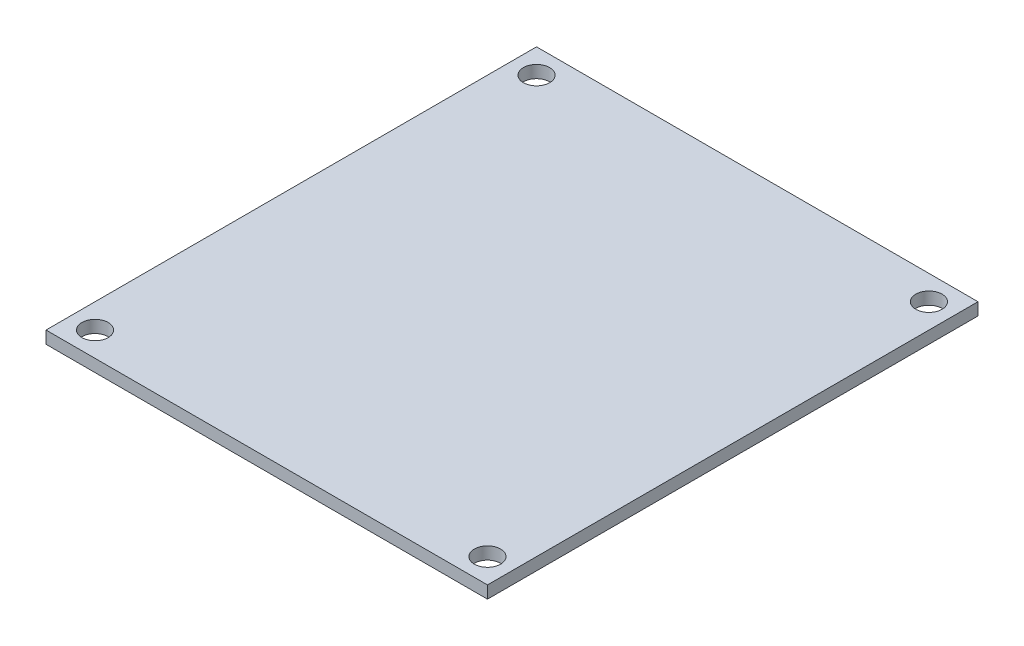
ISO-10303-21;
HEADER;
FILE_DESCRIPTION(('STEP AP214'),'2;1');
FILE_NAME('part.step','',(''),(''),'','','');
FILE_SCHEMA(('AUTOMOTIVE_DESIGN { 1 0 10303 214 1 1 1 1 }'));
ENDSEC;
DATA;
#1=APPLICATION_CONTEXT('core data for automotive mechanical design processes');
#2=APPLICATION_PROTOCOL_DEFINITION('international standard','automotive_design',2000,#1);
#3=PRODUCT_CONTEXT('',#1,'mechanical');
#4=PRODUCT('Part','Part','',(#3));
#5=PRODUCT_RELATED_PRODUCT_CATEGORY('part','',(#4));
#6=PRODUCT_DEFINITION_FORMATION('','',#4);
#7=PRODUCT_DEFINITION_CONTEXT('part definition',#1,'design');
#8=PRODUCT_DEFINITION('design','',#6,#7);
#9=PRODUCT_DEFINITION_SHAPE('','',#8);
#10=(LENGTH_UNIT() NAMED_UNIT(*) SI_UNIT(.MILLI.,.METRE.));
#11=(NAMED_UNIT(*) PLANE_ANGLE_UNIT() SI_UNIT($,.RADIAN.));
#12=(NAMED_UNIT(*) SI_UNIT($,.STERADIAN.) SOLID_ANGLE_UNIT());
#13=UNCERTAINTY_MEASURE_WITH_UNIT(LENGTH_MEASURE(1.E-05),#10,'distance_accuracy_value','');
#14=(GEOMETRIC_REPRESENTATION_CONTEXT(3) GLOBAL_UNCERTAINTY_ASSIGNED_CONTEXT((#13)) GLOBAL_UNIT_ASSIGNED_CONTEXT((#10,
#11,#12)) REPRESENTATION_CONTEXT('',''));
#15=CARTESIAN_POINT('',(0.,0.,0.));
#16=DIRECTION('',(0.,0.,1.));
#17=DIRECTION('',(1.,0.,0.));
#18=AXIS2_PLACEMENT_3D('',#15,#16,#17);
#19=CARTESIAN_POINT('',(28.575,1.6,31.75));
#20=DIRECTION('',(-1.,0.,0.));
#21=DIRECTION('',(0.,0.,1.));
#22=AXIS2_PLACEMENT_3D('',#19,#20,#21);
#23=PLANE('',#22);
#24=DIRECTION('',(0.,0.,-1.));
#25=VECTOR('',#24,1.);
#26=CARTESIAN_POINT('',(28.575,0.,31.75));
#27=LINE('',#26,#25);
#28=CARTESIAN_POINT('',(28.575,0.,31.75));
#29=VERTEX_POINT('',#28);
#30=CARTESIAN_POINT('',(28.575,0.,-31.75));
#31=VERTEX_POINT('',#30);
#32=EDGE_CURVE('E100',#29,#31,#27,.T.);
#33=ORIENTED_EDGE('',*,*,#32,.T.);
#34=DIRECTION('',(0.,-1.,0.));
#35=VECTOR('',#34,1.);
#36=CARTESIAN_POINT('',(28.575,1.6,-31.75));
#37=LINE('',#36,#35);
#38=CARTESIAN_POINT('',(28.575,1.6,-31.75));
#39=VERTEX_POINT('',#38);
#40=EDGE_CURVE('E11',#39,#31,#37,.T.);
#41=ORIENTED_EDGE('',*,*,#40,.F.);
#42=DIRECTION('',(0.,0.,-1.));
#43=VECTOR('',#42,1.);
#44=CARTESIAN_POINT('',(28.575,1.6,31.75));
#45=LINE('',#44,#43);
#46=CARTESIAN_POINT('',(28.575,1.6,31.75));
#47=VERTEX_POINT('',#46);
#48=EDGE_CURVE('E87',#47,#39,#45,.T.);
#49=ORIENTED_EDGE('',*,*,#48,.F.);
#50=DIRECTION('',(0.,-1.,0.));
#51=VECTOR('',#50,1.);
#52=CARTESIAN_POINT('',(28.575,1.6,31.75));
#53=LINE('',#52,#51);
#54=EDGE_CURVE('E96',#47,#29,#53,.T.);
#55=ORIENTED_EDGE('',*,*,#54,.T.);
#56=EDGE_LOOP('',(#33,#41,#49,#55));
#57=FACE_BOUND('',#56,.T.);
#58=ADVANCED_FACE('F34',(#57),#23,.F.);
#59=CARTESIAN_POINT('',(-28.575,1.6,-31.75));
#60=DIRECTION('',(0.,0.,1.));
#61=DIRECTION('',(1.,0.,0.));
#62=AXIS2_PLACEMENT_3D('',#59,#60,#61);
#63=PLANE('',#62);
#64=DIRECTION('',(-1.,0.,0.));
#65=VECTOR('',#64,1.);
#66=CARTESIAN_POINT('',(-28.575,0.,-31.75));
#67=LINE('',#66,#65);
#68=CARTESIAN_POINT('',(-28.575,0.,-31.75));
#69=VERTEX_POINT('',#68);
#70=EDGE_CURVE('E91',#31,#69,#67,.T.);
#71=ORIENTED_EDGE('',*,*,#70,.T.);
#72=DIRECTION('',(0.,-1.,0.));
#73=VECTOR('',#72,1.);
#74=CARTESIAN_POINT('',(-28.575,1.6,-31.75));
#75=LINE('',#74,#73);
#76=CARTESIAN_POINT('',(-28.575,1.6,-31.75));
#77=VERTEX_POINT('',#76);
#78=EDGE_CURVE('E43',#77,#69,#75,.T.);
#79=ORIENTED_EDGE('',*,*,#78,.F.);
#80=DIRECTION('',(-1.,0.,0.));
#81=VECTOR('',#80,1.);
#82=CARTESIAN_POINT('',(-28.575,1.6,-31.75));
#83=LINE('',#82,#81);
#84=EDGE_CURVE('E82',#39,#77,#83,.T.);
#85=ORIENTED_EDGE('',*,*,#84,.F.);
#86=ORIENTED_EDGE('',*,*,#40,.T.);
#87=EDGE_LOOP('',(#71,#79,#85,#86));
#88=FACE_BOUND('',#87,.T.);
#89=ADVANCED_FACE('F90',(#88),#63,.F.);
#90=CARTESIAN_POINT('',(-28.575,1.6,31.75));
#91=DIRECTION('',(1.,0.,0.));
#92=DIRECTION('',(0.,0.,-1.));
#93=AXIS2_PLACEMENT_3D('',#90,#91,#92);
#94=PLANE('',#93);
#95=DIRECTION('',(0.,0.,1.));
#96=VECTOR('',#95,1.);
#97=CARTESIAN_POINT('',(-28.575,0.,31.75));
#98=LINE('',#97,#96);
#99=CARTESIAN_POINT('',(-28.575,0.,31.75));
#100=VERTEX_POINT('',#99);
#101=EDGE_CURVE('E69',#69,#100,#98,.T.);
#102=ORIENTED_EDGE('',*,*,#101,.T.);
#103=DIRECTION('',(0.,-1.,0.));
#104=VECTOR('',#103,1.);
#105=CARTESIAN_POINT('',(-28.575,1.6,31.75));
#106=LINE('',#105,#104);
#107=CARTESIAN_POINT('',(-28.575,1.6,31.75));
#108=VERTEX_POINT('',#107);
#109=EDGE_CURVE('E92',#108,#100,#106,.T.);
#110=ORIENTED_EDGE('',*,*,#109,.F.);
#111=DIRECTION('',(0.,0.,1.));
#112=VECTOR('',#111,1.);
#113=CARTESIAN_POINT('',(-28.575,1.6,31.75));
#114=LINE('',#113,#112);
#115=EDGE_CURVE('E85',#77,#108,#114,.T.);
#116=ORIENTED_EDGE('',*,*,#115,.F.);
#117=ORIENTED_EDGE('',*,*,#78,.T.);
#118=EDGE_LOOP('',(#102,#110,#116,#117));
#119=FACE_BOUND('',#118,.T.);
#120=ADVANCED_FACE('F94',(#119),#94,.F.);
#121=CARTESIAN_POINT('',(-28.575,1.6,31.75));
#122=DIRECTION('',(0.,0.,-1.));
#123=DIRECTION('',(-1.,0.,0.));
#124=AXIS2_PLACEMENT_3D('',#121,#122,#123);
#125=PLANE('',#124);
#126=DIRECTION('',(1.,0.,0.));
#127=VECTOR('',#126,1.);
#128=CARTESIAN_POINT('',(-28.575,0.,31.75));
#129=LINE('',#128,#127);
#130=EDGE_CURVE('E75',#100,#29,#129,.T.);
#131=ORIENTED_EDGE('',*,*,#130,.T.);
#132=ORIENTED_EDGE('',*,*,#54,.F.);
#133=DIRECTION('',(1.,0.,0.));
#134=VECTOR('',#133,1.);
#135=CARTESIAN_POINT('',(-28.575,1.6,31.75));
#136=LINE('',#135,#134);
#137=EDGE_CURVE('E52',#108,#47,#136,.T.);
#138=ORIENTED_EDGE('',*,*,#137,.F.);
#139=ORIENTED_EDGE('',*,*,#109,.T.);
#140=EDGE_LOOP('',(#131,#132,#138,#139));
#141=FACE_BOUND('',#140,.T.);
#142=ADVANCED_FACE('F143',(#141),#125,.F.);
#143=CARTESIAN_POINT('',(0.,1.6,0.));
#144=DIRECTION('',(0.,-1.,0.));
#145=DIRECTION('',(0.,0.,-1.));
#146=AXIS2_PLACEMENT_3D('',#143,#144,#145);
#147=PLANE('',#146);
#148=CARTESIAN_POINT('',(-25.4,1.6,-28.575));
#149=DIRECTION('',(0.,1.,0.));
#150=DIRECTION('',(0.,0.,1.));
#151=AXIS2_PLACEMENT_3D('',#148,#149,#150);
#152=CIRCLE('',#151,1.69999999999999);
#153=CARTESIAN_POINT('',(-25.4,1.6,-26.875));
#154=VERTEX_POINT('',#153);
#155=EDGE_CURVE('E125',#154,#154,#152,.T.);
#156=ORIENTED_EDGE('',*,*,#155,.F.);
#157=EDGE_LOOP('',(#156));
#158=FACE_BOUND('',#157,.T.);
#159=CARTESIAN_POINT('',(25.4,1.6,-28.575));
#160=DIRECTION('',(0.,1.,0.));
#161=DIRECTION('',(0.,0.,1.));
#162=AXIS2_PLACEMENT_3D('',#159,#160,#161);
#163=CIRCLE('',#162,1.69999999999999);
#164=CARTESIAN_POINT('',(25.4,1.6,-26.875));
#165=VERTEX_POINT('',#164);
#166=EDGE_CURVE('E115',#165,#165,#163,.T.);
#167=ORIENTED_EDGE('',*,*,#166,.F.);
#168=EDGE_LOOP('',(#167));
#169=FACE_BOUND('',#168,.T.);
#170=CARTESIAN_POINT('',(25.4,1.6,28.575));
#171=DIRECTION('',(0.,1.,0.));
#172=DIRECTION('',(0.,0.,1.));
#173=AXIS2_PLACEMENT_3D('',#170,#171,#172);
#174=CIRCLE('',#173,1.69999999999999);
#175=CARTESIAN_POINT('',(25.4,1.6,30.275));
#176=VERTEX_POINT('',#175);
#177=EDGE_CURVE('E112',#176,#176,#174,.T.);
#178=ORIENTED_EDGE('',*,*,#177,.F.);
#179=EDGE_LOOP('',(#178));
#180=FACE_BOUND('',#179,.T.);
#181=CARTESIAN_POINT('',(-25.4,1.6,28.575));
#182=DIRECTION('',(0.,1.,0.));
#183=DIRECTION('',(0.,0.,1.));
#184=AXIS2_PLACEMENT_3D('',#181,#182,#183);
#185=CIRCLE('',#184,1.69999999999999);
#186=CARTESIAN_POINT('',(-25.4,1.6,30.275));
#187=VERTEX_POINT('',#186);
#188=EDGE_CURVE('E111',#187,#187,#185,.T.);
#189=ORIENTED_EDGE('',*,*,#188,.F.);
#190=EDGE_LOOP('',(#189));
#191=FACE_BOUND('',#190,.T.);
#192=ORIENTED_EDGE('',*,*,#48,.T.);
#193=ORIENTED_EDGE('',*,*,#84,.T.);
#194=ORIENTED_EDGE('',*,*,#115,.T.);
#195=ORIENTED_EDGE('',*,*,#137,.T.);
#196=EDGE_LOOP('',(#192,#193,#194,#195));
#197=FACE_BOUND('',#196,.T.);
#198=ADVANCED_FACE('F83',(#158,#169,#180,#191,#197),#147,.F.);
#199=CARTESIAN_POINT('',(0.,0.,0.));
#200=DIRECTION('',(0.,-1.,0.));
#201=DIRECTION('',(0.,0.,-1.));
#202=AXIS2_PLACEMENT_3D('',#199,#200,#201);
#203=PLANE('',#202);
#204=CARTESIAN_POINT('',(-25.4,0.,-28.575));
#205=DIRECTION('',(0.,-1.,0.));
#206=DIRECTION('',(0.,0.,-1.));
#207=AXIS2_PLACEMENT_3D('',#204,#205,#206);
#208=CIRCLE('',#207,1.69999999999999);
#209=CARTESIAN_POINT('',(-25.4,0.,-30.275));
#210=VERTEX_POINT('',#209);
#211=EDGE_CURVE('E37',#210,#210,#208,.T.);
#212=ORIENTED_EDGE('',*,*,#211,.F.);
#213=EDGE_LOOP('',(#212));
#214=FACE_BOUND('',#213,.T.);
#215=CARTESIAN_POINT('',(25.4,0.,-28.575));
#216=DIRECTION('',(0.,-1.,0.));
#217=DIRECTION('',(0.,0.,-1.));
#218=AXIS2_PLACEMENT_3D('',#215,#216,#217);
#219=CIRCLE('',#218,1.69999999999999);
#220=CARTESIAN_POINT('',(25.4,0.,-30.275));
#221=VERTEX_POINT('',#220);
#222=EDGE_CURVE('E113',#221,#221,#219,.T.);
#223=ORIENTED_EDGE('',*,*,#222,.F.);
#224=EDGE_LOOP('',(#223));
#225=FACE_BOUND('',#224,.T.);
#226=CARTESIAN_POINT('',(25.4,0.,28.575));
#227=DIRECTION('',(0.,-1.,0.));
#228=DIRECTION('',(0.,0.,-1.));
#229=AXIS2_PLACEMENT_3D('',#226,#227,#228);
#230=CIRCLE('',#229,1.69999999999999);
#231=CARTESIAN_POINT('',(25.4,0.,26.875));
#232=VERTEX_POINT('',#231);
#233=EDGE_CURVE('E109',#232,#232,#230,.T.);
#234=ORIENTED_EDGE('',*,*,#233,.F.);
#235=EDGE_LOOP('',(#234));
#236=FACE_BOUND('',#235,.T.);
#237=CARTESIAN_POINT('',(-25.4,0.,28.575));
#238=DIRECTION('',(0.,-1.,0.));
#239=DIRECTION('',(0.,0.,-1.));
#240=AXIS2_PLACEMENT_3D('',#237,#238,#239);
#241=CIRCLE('',#240,1.69999999999999);
#242=CARTESIAN_POINT('',(-25.4,0.,26.875));
#243=VERTEX_POINT('',#242);
#244=EDGE_CURVE('E103',#243,#243,#241,.T.);
#245=ORIENTED_EDGE('',*,*,#244,.F.);
#246=EDGE_LOOP('',(#245));
#247=FACE_BOUND('',#246,.T.);
#248=ORIENTED_EDGE('',*,*,#32,.F.);
#249=ORIENTED_EDGE('',*,*,#130,.F.);
#250=ORIENTED_EDGE('',*,*,#101,.F.);
#251=ORIENTED_EDGE('',*,*,#70,.F.);
#252=EDGE_LOOP('',(#248,#249,#250,#251));
#253=FACE_BOUND('',#252,.T.);
#254=ADVANCED_FACE('F136',(#214,#225,#236,#247,#253),#203,.T.);
#255=CARTESIAN_POINT('',(-25.4,1.6,28.575));
#256=DIRECTION('',(0.,1.,0.));
#257=DIRECTION('',(0.,0.,1.));
#258=AXIS2_PLACEMENT_3D('',#255,#256,#257);
#259=CYLINDRICAL_SURFACE('',#258,1.69999999999999);
#260=ORIENTED_EDGE('',*,*,#244,.T.);
#261=EDGE_LOOP('',(#260));
#262=FACE_BOUND('',#261,.T.);
#263=ORIENTED_EDGE('',*,*,#188,.T.);
#264=EDGE_LOOP('',(#263));
#265=FACE_BOUND('',#264,.T.);
#266=ADVANCED_FACE('F133',(#262,#265),#259,.F.);
#267=CARTESIAN_POINT('',(25.4,1.6,28.575));
#268=DIRECTION('',(0.,1.,0.));
#269=DIRECTION('',(0.,0.,1.));
#270=AXIS2_PLACEMENT_3D('',#267,#268,#269);
#271=CYLINDRICAL_SURFACE('',#270,1.69999999999999);
#272=ORIENTED_EDGE('',*,*,#233,.T.);
#273=EDGE_LOOP('',(#272));
#274=FACE_BOUND('',#273,.T.);
#275=ORIENTED_EDGE('',*,*,#177,.T.);
#276=EDGE_LOOP('',(#275));
#277=FACE_BOUND('',#276,.T.);
#278=ADVANCED_FACE('F188',(#274,#277),#271,.F.);
#279=CARTESIAN_POINT('',(25.4,1.6,-28.575));
#280=DIRECTION('',(0.,1.,0.));
#281=DIRECTION('',(0.,0.,1.));
#282=AXIS2_PLACEMENT_3D('',#279,#280,#281);
#283=CYLINDRICAL_SURFACE('',#282,1.69999999999999);
#284=ORIENTED_EDGE('',*,*,#222,.T.);
#285=EDGE_LOOP('',(#284));
#286=FACE_BOUND('',#285,.T.);
#287=ORIENTED_EDGE('',*,*,#166,.T.);
#288=EDGE_LOOP('',(#287));
#289=FACE_BOUND('',#288,.T.);
#290=ADVANCED_FACE('F197',(#286,#289),#283,.F.);
#291=CARTESIAN_POINT('',(-25.4,1.6,-28.575));
#292=DIRECTION('',(0.,1.,0.));
#293=DIRECTION('',(0.,0.,1.));
#294=AXIS2_PLACEMENT_3D('',#291,#292,#293);
#295=CYLINDRICAL_SURFACE('',#294,1.69999999999999);
#296=ORIENTED_EDGE('',*,*,#211,.T.);
#297=EDGE_LOOP('',(#296));
#298=FACE_BOUND('',#297,.T.);
#299=ORIENTED_EDGE('',*,*,#155,.T.);
#300=EDGE_LOOP('',(#299));
#301=FACE_BOUND('',#300,.T.);
#302=ADVANCED_FACE('F207',(#298,#301),#295,.F.);
#303=CLOSED_SHELL('',(#58,#89,#120,#142,#198,#254,#266,#278,#290,#302));
#304=MANIFOLD_SOLID_BREP('B2',#303);
#305=ADVANCED_BREP_SHAPE_REPRESENTATION('',(#18,#304),#14);
#306=SHAPE_DEFINITION_REPRESENTATION(#9,#305);
ENDSEC;
END-ISO-10303-21;
